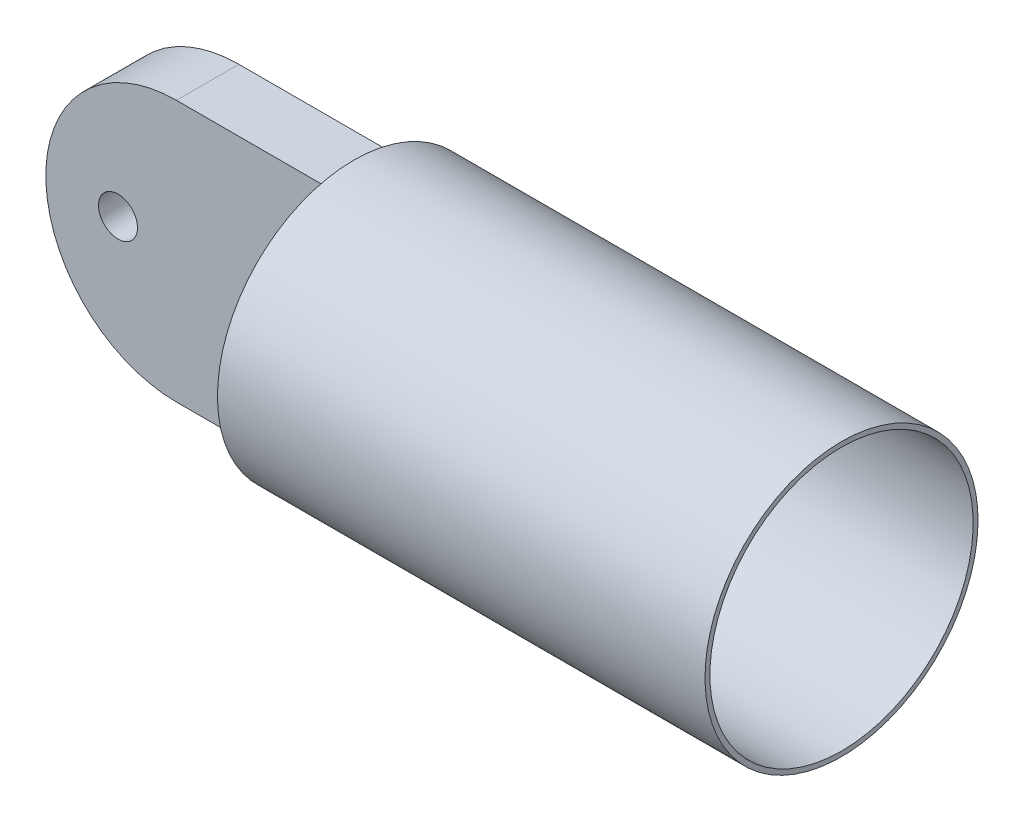
ISO-10303-21;
HEADER;
FILE_DESCRIPTION(('STEP AP214'),'2;1');
FILE_NAME('part.step','',(''),(''),'','','');
FILE_SCHEMA(('AUTOMOTIVE_DESIGN { 1 0 10303 214 1 1 1 1 }'));
ENDSEC;
DATA;
#1=APPLICATION_CONTEXT('core data for automotive mechanical design processes');
#2=APPLICATION_PROTOCOL_DEFINITION('international standard','automotive_design',2000,#1);
#3=PRODUCT_CONTEXT('',#1,'mechanical');
#4=PRODUCT('Part','Part','',(#3));
#5=PRODUCT_RELATED_PRODUCT_CATEGORY('part','',(#4));
#6=PRODUCT_DEFINITION_FORMATION('','',#4);
#7=PRODUCT_DEFINITION_CONTEXT('part definition',#1,'design');
#8=PRODUCT_DEFINITION('design','',#6,#7);
#9=PRODUCT_DEFINITION_SHAPE('','',#8);
#10=(LENGTH_UNIT() NAMED_UNIT(*) SI_UNIT(.MILLI.,.METRE.));
#11=(NAMED_UNIT(*) PLANE_ANGLE_UNIT() SI_UNIT($,.RADIAN.));
#12=(NAMED_UNIT(*) SI_UNIT($,.STERADIAN.) SOLID_ANGLE_UNIT());
#13=UNCERTAINTY_MEASURE_WITH_UNIT(LENGTH_MEASURE(1.E-05),#10,'distance_accuracy_value','');
#14=(GEOMETRIC_REPRESENTATION_CONTEXT(3) GLOBAL_UNCERTAINTY_ASSIGNED_CONTEXT((#13)) GLOBAL_UNIT_ASSIGNED_CONTEXT((#10,
#11,#12)) REPRESENTATION_CONTEXT('',''));
#15=CARTESIAN_POINT('',(0.,0.,0.));
#16=DIRECTION('',(0.,0.,1.));
#17=DIRECTION('',(1.,0.,0.));
#18=AXIS2_PLACEMENT_3D('',#15,#16,#17);
#19=CARTESIAN_POINT('',(-567.059552989297,341.601354358108,64.));
#20=DIRECTION('',(0.,0.,-1.));
#21=DIRECTION('',(-1.,0.,0.));
#22=AXIS2_PLACEMENT_3D('',#19,#20,#21);
#23=CYLINDRICAL_SURFACE('',#22,134.);
#24=CARTESIAN_POINT('',(-567.059552989297,341.601354358108,0.));
#25=DIRECTION('',(0.,0.,1.));
#26=DIRECTION('',(-1.,0.,0.));
#27=AXIS2_PLACEMENT_3D('',#24,#25,#26);
#28=CIRCLE('',#27,134.);
#29=CARTESIAN_POINT('',(-567.059552989297,475.601354358108,0.));
#30=VERTEX_POINT('',#29);
#31=CARTESIAN_POINT('',(-567.059552989297,207.601354358108,0.));
#32=VERTEX_POINT('',#31);
#33=EDGE_CURVE('E171',#30,#32,#28,.T.);
#34=ORIENTED_EDGE('',*,*,#33,.T.);
#35=DIRECTION('',(0.,0.,-1.));
#36=VECTOR('',#35,1.);
#37=CARTESIAN_POINT('',(-567.059552989297,207.601354358108,64.));
#38=LINE('',#37,#36);
#39=CARTESIAN_POINT('',(-567.059552989297,207.601354358108,64.));
#40=VERTEX_POINT('',#39);
#41=EDGE_CURVE('E11',#40,#32,#38,.T.);
#42=ORIENTED_EDGE('',*,*,#41,.F.);
#43=CARTESIAN_POINT('',(-567.059552989297,341.601354358108,64.));
#44=DIRECTION('',(0.,0.,1.));
#45=DIRECTION('',(-1.,0.,0.));
#46=AXIS2_PLACEMENT_3D('',#43,#44,#45);
#47=CIRCLE('',#46,134.);
#48=CARTESIAN_POINT('',(-567.059552989297,475.601354358108,64.));
#49=VERTEX_POINT('',#48);
#50=EDGE_CURVE('E172',#49,#40,#47,.T.);
#51=ORIENTED_EDGE('',*,*,#50,.F.);
#52=DIRECTION('',(0.,0.,-1.));
#53=VECTOR('',#52,1.);
#54=CARTESIAN_POINT('',(-567.059552989297,475.601354358108,64.));
#55=LINE('',#54,#53);
#56=EDGE_CURVE('E178',#49,#30,#55,.T.);
#57=ORIENTED_EDGE('',*,*,#56,.T.);
#58=EDGE_LOOP('',(#34,#42,#51,#57));
#59=FACE_BOUND('',#58,.T.);
#60=ADVANCED_FACE('F36',(#59),#23,.T.);
#61=CARTESIAN_POINT('',(-567.059552989297,207.601354358108,64.));
#62=DIRECTION('',(0.,1.,0.));
#63=DIRECTION('',(0.,0.,1.));
#64=AXIS2_PLACEMENT_3D('',#61,#62,#63);
#65=PLANE('',#64);
#66=DIRECTION('',(1.,0.,0.));
#67=VECTOR('',#66,1.);
#68=CARTESIAN_POINT('',(-567.059552989297,207.601354358108,0.));
#69=LINE('',#68,#67);
#70=CARTESIAN_POINT('',(-417.059552989296,207.601354358108,0.));
#71=VERTEX_POINT('',#70);
#72=EDGE_CURVE('E181',#32,#71,#69,.T.);
#73=ORIENTED_EDGE('',*,*,#72,.T.);
#74=DIRECTION('',(0.,0.,-1.));
#75=VECTOR('',#74,1.);
#76=CARTESIAN_POINT('',(-417.059552989296,207.601354358108,64.));
#77=LINE('',#76,#75);
#78=CARTESIAN_POINT('',(-417.059552989296,207.601354358108,64.));
#79=VERTEX_POINT('',#78);
#80=EDGE_CURVE('E44',#79,#71,#77,.T.);
#81=ORIENTED_EDGE('',*,*,#80,.F.);
#82=DIRECTION('',(1.,0.,0.));
#83=VECTOR('',#82,1.);
#84=CARTESIAN_POINT('',(-567.059552989297,207.601354358108,64.));
#85=LINE('',#84,#83);
#86=EDGE_CURVE('E76',#40,#79,#85,.T.);
#87=ORIENTED_EDGE('',*,*,#86,.F.);
#88=ORIENTED_EDGE('',*,*,#41,.T.);
#89=EDGE_LOOP('',(#73,#81,#87,#88));
#90=FACE_BOUND('',#89,.T.);
#91=ADVANCED_FACE('F193',(#90),#65,.F.);
#92=CARTESIAN_POINT('',(-567.059552989297,475.601354358108,64.));
#93=DIRECTION('',(0.,-1.,0.));
#94=DIRECTION('',(0.,0.,-1.));
#95=AXIS2_PLACEMENT_3D('',#92,#93,#94);
#96=PLANE('',#95);
#97=DIRECTION('',(-1.,0.,0.));
#98=VECTOR('',#97,1.);
#99=CARTESIAN_POINT('',(-567.059552989297,475.601354358108,0.));
#100=LINE('',#99,#98);
#101=CARTESIAN_POINT('',(-417.059552989297,475.601354358108,0.));
#102=VERTEX_POINT('',#101);
#103=EDGE_CURVE('E69',#102,#30,#100,.T.);
#104=ORIENTED_EDGE('',*,*,#103,.T.);
#105=ORIENTED_EDGE('',*,*,#56,.F.);
#106=DIRECTION('',(-1.,0.,0.));
#107=VECTOR('',#106,1.);
#108=CARTESIAN_POINT('',(-567.059552989297,475.601354358108,64.));
#109=LINE('',#108,#107);
#110=CARTESIAN_POINT('',(-417.059552989297,475.601354358108,64.));
#111=VERTEX_POINT('',#110);
#112=EDGE_CURVE('E52',#111,#49,#109,.T.);
#113=ORIENTED_EDGE('',*,*,#112,.F.);
#114=DIRECTION('',(0.,0.,-1.));
#115=VECTOR('',#114,1.);
#116=CARTESIAN_POINT('',(-417.059552989297,475.601354358108,64.));
#117=LINE('',#116,#115);
#118=EDGE_CURVE('E66',#111,#102,#117,.T.);
#119=ORIENTED_EDGE('',*,*,#118,.T.);
#120=EDGE_LOOP('',(#104,#105,#113,#119));
#121=FACE_BOUND('',#120,.T.);
#122=ADVANCED_FACE('F200',(#121),#96,.F.);
#123=CARTESIAN_POINT('',(-567.059552989297,341.601354358108,64.));
#124=DIRECTION('',(0.,0.,-1.));
#125=DIRECTION('',(-1.,0.,0.));
#126=AXIS2_PLACEMENT_3D('',#123,#124,#125);
#127=PLANE('',#126);
#128=CARTESIAN_POINT('',(-627.059552989297,342.387508152234,64.));
#129=DIRECTION('',(0.,0.,-1.));
#130=DIRECTION('',(-1.,0.,0.));
#131=AXIS2_PLACEMENT_3D('',#128,#129,#130);
#132=CIRCLE('',#131,20.);
#133=CARTESIAN_POINT('',(-647.059552989298,342.387508152234,64.));
#134=VERTEX_POINT('',#133);
#135=EDGE_CURVE('E168',#134,#134,#132,.T.);
#136=ORIENTED_EDGE('',*,*,#135,.T.);
#137=EDGE_LOOP('',(#136));
#138=FACE_BOUND('',#137,.T.);
#139=ORIENTED_EDGE('',*,*,#50,.T.);
#140=ORIENTED_EDGE('',*,*,#86,.T.);
#141=DIRECTION('',(0.,1.,0.));
#142=VECTOR('',#141,1.);
#143=CARTESIAN_POINT('',(-417.059552989297,475.601354358108,64.));
#144=LINE('',#143,#142);
#145=EDGE_CURVE('E175',#79,#111,#144,.T.);
#146=ORIENTED_EDGE('',*,*,#145,.T.);
#147=ORIENTED_EDGE('',*,*,#112,.T.);
#148=EDGE_LOOP('',(#139,#140,#146,#147));
#149=FACE_BOUND('',#148,.T.);
#150=ADVANCED_FACE('F202',(#138,#149),#127,.F.);
#151=CARTESIAN_POINT('',(-567.059552989297,341.601354358108,0.));
#152=DIRECTION('',(0.,0.,-1.));
#153=DIRECTION('',(-1.,0.,0.));
#154=AXIS2_PLACEMENT_3D('',#151,#152,#153);
#155=PLANE('',#154);
#156=CARTESIAN_POINT('',(-627.059552989297,342.387508152234,0.));
#157=DIRECTION('',(0.,0.,1.));
#158=DIRECTION('',(1.,0.,0.));
#159=AXIS2_PLACEMENT_3D('',#156,#157,#158);
#160=CIRCLE('',#159,20.);
#161=CARTESIAN_POINT('',(-607.059552989297,342.387508152234,0.));
#162=VERTEX_POINT('',#161);
#163=EDGE_CURVE('E163',#162,#162,#160,.T.);
#164=ORIENTED_EDGE('',*,*,#163,.T.);
#165=EDGE_LOOP('',(#164));
#166=FACE_BOUND('',#165,.T.);
#167=ORIENTED_EDGE('',*,*,#33,.F.);
#168=ORIENTED_EDGE('',*,*,#103,.F.);
#169=DIRECTION('',(0.,1.,0.));
#170=VECTOR('',#169,1.);
#171=CARTESIAN_POINT('',(-417.059552989297,475.601354358108,0.));
#172=LINE('',#171,#170);
#173=EDGE_CURVE('E184',#71,#102,#172,.T.);
#174=ORIENTED_EDGE('',*,*,#173,.F.);
#175=ORIENTED_EDGE('',*,*,#72,.F.);
#176=EDGE_LOOP('',(#167,#168,#174,#175));
#177=FACE_BOUND('',#176,.T.);
#178=ADVANCED_FACE('F197',(#166,#177),#155,.T.);
#179=CARTESIAN_POINT('',(-627.059552989297,342.387508152234,0.));
#180=DIRECTION('',(0.,0.,1.));
#181=DIRECTION('',(1.,0.,0.));
#182=AXIS2_PLACEMENT_3D('',#179,#180,#181);
#183=CYLINDRICAL_SURFACE('',#182,20.);
#184=ORIENTED_EDGE('',*,*,#163,.F.);
#185=EDGE_LOOP('',(#184));
#186=FACE_BOUND('',#185,.T.);
#187=ORIENTED_EDGE('',*,*,#135,.F.);
#188=EDGE_LOOP('',(#187));
#189=FACE_BOUND('',#188,.T.);
#190=ADVANCED_FACE('F225',(#186,#189),#183,.F.);
#191=CARTESIAN_POINT('',(-417.059552989297,341.601354358108,32.));
#192=DIRECTION('',(1.,0.,0.));
#193=DIRECTION('',(0.,1.,0.));
#194=AXIS2_PLACEMENT_3D('',#191,#192,#193);
#195=PLANE('',#194);
#196=CARTESIAN_POINT('',(-417.059552989297,341.601354358108,32.));
#197=DIRECTION('',(1.,0.,0.));
#198=DIRECTION('',(0.,1.,0.));
#199=AXIS2_PLACEMENT_3D('',#196,#197,#198);
#200=CIRCLE('',#199,140.);
#201=CARTESIAN_POINT('',(-417.059552989297,481.601354358108,32.));
#202=VERTEX_POINT('',#201);
#203=EDGE_CURVE('E126',#202,#202,#200,.T.);
#204=ORIENTED_EDGE('',*,*,#203,.F.);
#205=EDGE_LOOP('',(#204));
#206=FACE_BOUND('',#205,.T.);
#207=ORIENTED_EDGE('',*,*,#80,.T.);
#208=ORIENTED_EDGE('',*,*,#173,.T.);
#209=ORIENTED_EDGE('',*,*,#118,.F.);
#210=ORIENTED_EDGE('',*,*,#145,.F.);
#211=EDGE_LOOP('',(#207,#208,#209,#210));
#212=FACE_BOUND('',#211,.T.);
#213=ADVANCED_FACE('F192',(#206,#212),#195,.F.);
#214=CARTESIAN_POINT('',(82.9404470107033,341.601354358111,32.));
#215=DIRECTION('',(-1.,0.,0.));
#216=DIRECTION('',(0.,-1.,0.));
#217=AXIS2_PLACEMENT_3D('',#214,#215,#216);
#218=CYLINDRICAL_SURFACE('',#217,140.);
#219=CARTESIAN_POINT('',(82.9404470107033,341.601354358111,32.));
#220=DIRECTION('',(1.,0.,0.));
#221=DIRECTION('',(0.,1.,0.));
#222=AXIS2_PLACEMENT_3D('',#219,#220,#221);
#223=CIRCLE('',#222,140.);
#224=CARTESIAN_POINT('',(82.9404470107026,481.601354358111,32.));
#225=VERTEX_POINT('',#224);
#226=EDGE_CURVE('E160',#225,#225,#223,.T.);
#227=ORIENTED_EDGE('',*,*,#226,.F.);
#228=EDGE_LOOP('',(#227));
#229=FACE_BOUND('',#228,.T.);
#230=ORIENTED_EDGE('',*,*,#203,.T.);
#231=EDGE_LOOP('',(#230));
#232=FACE_BOUND('',#231,.T.);
#233=ADVANCED_FACE('F254',(#229,#232),#218,.T.);
#234=CARTESIAN_POINT('',(82.9404470107033,341.601354358111,32.));
#235=DIRECTION('',(1.,0.,0.));
#236=DIRECTION('',(0.,1.,0.));
#237=AXIS2_PLACEMENT_3D('',#234,#235,#236);
#238=PLANE('',#237);
#239=CARTESIAN_POINT('',(82.9404470107033,341.601354358111,32.));
#240=DIRECTION('',(1.,0.,0.));
#241=DIRECTION('',(0.,1.,0.));
#242=AXIS2_PLACEMENT_3D('',#239,#240,#241);
#243=CIRCLE('',#242,135.);
#244=CARTESIAN_POINT('',(82.9404470107026,476.601354358111,32.));
#245=VERTEX_POINT('',#244);
#246=EDGE_CURVE('E153',#245,#245,#243,.T.);
#247=ORIENTED_EDGE('',*,*,#246,.F.);
#248=EDGE_LOOP('',(#247));
#249=FACE_BOUND('',#248,.T.);
#250=ORIENTED_EDGE('',*,*,#226,.T.);
#251=EDGE_LOOP('',(#250));
#252=FACE_BOUND('',#251,.T.);
#253=ADVANCED_FACE('F265',(#249,#252),#238,.T.);
#254=CARTESIAN_POINT('',(-567.059552989297,341.601354358108,64.));
#255=DIRECTION('',(0.,0.,-1.));
#256=DIRECTION('',(-1.,0.,0.));
#257=AXIS2_PLACEMENT_3D('',#254,#255,#256);
#258=CYLINDRICAL_SURFACE('',#257,129.);
#259=CARTESIAN_POINT('',(-567.059552989297,341.601354358108,5.));
#260=DIRECTION('',(0.,0.,-1.));
#261=DIRECTION('',(-1.,0.,0.));
#262=AXIS2_PLACEMENT_3D('',#259,#260,#261);
#263=CIRCLE('',#262,129.);
#264=CARTESIAN_POINT('',(-567.059552989297,470.601354358108,5.));
#265=VERTEX_POINT('',#264);
#266=CARTESIAN_POINT('',(-567.059552989297,212.601354358108,5.));
#267=VERTEX_POINT('',#266);
#268=EDGE_CURVE('E117',#265,#267,#263,.F.);
#269=ORIENTED_EDGE('',*,*,#268,.F.);
#270=DIRECTION('',(0.,0.,-1.));
#271=VECTOR('',#270,1.);
#272=CARTESIAN_POINT('',(-567.059552989297,470.601354358108,64.));
#273=LINE('',#272,#271);
#274=CARTESIAN_POINT('',(-567.059552989297,470.601354358108,59.));
#275=VERTEX_POINT('',#274);
#276=EDGE_CURVE('E140',#275,#265,#273,.T.);
#277=ORIENTED_EDGE('',*,*,#276,.F.);
#278=CARTESIAN_POINT('',(-567.059552989297,341.601354358108,59.));
#279=DIRECTION('',(0.,0.,-1.));
#280=DIRECTION('',(-1.,0.,0.));
#281=AXIS2_PLACEMENT_3D('',#278,#279,#280);
#282=CIRCLE('',#281,129.);
#283=CARTESIAN_POINT('',(-567.059552989297,212.601354358108,59.));
#284=VERTEX_POINT('',#283);
#285=EDGE_CURVE('E125',#275,#284,#282,.F.);
#286=ORIENTED_EDGE('',*,*,#285,.T.);
#287=DIRECTION('',(0.,0.,1.));
#288=VECTOR('',#287,1.);
#289=CARTESIAN_POINT('',(-567.059552989297,212.601354358108,64.));
#290=LINE('',#289,#288);
#291=EDGE_CURVE('E110',#284,#267,#290,.F.);
#292=ORIENTED_EDGE('',*,*,#291,.T.);
#293=EDGE_LOOP('',(#269,#277,#286,#292));
#294=FACE_BOUND('',#293,.T.);
#295=ADVANCED_FACE('F122',(#294),#258,.F.);
#296=CARTESIAN_POINT('',(-567.059552989297,212.601354358108,64.));
#297=DIRECTION('',(0.,1.,0.));
#298=DIRECTION('',(0.,0.,1.));
#299=AXIS2_PLACEMENT_3D('',#296,#297,#298);
#300=PLANE('',#299);
#301=DIRECTION('',(1.,0.,0.));
#302=VECTOR('',#301,1.);
#303=CARTESIAN_POINT('',(-567.059552989297,212.601354358108,5.));
#304=LINE('',#303,#302);
#305=CARTESIAN_POINT('',(-412.059552989296,212.601354358108,5.));
#306=VERTEX_POINT('',#305);
#307=EDGE_CURVE('E107',#267,#306,#304,.T.);
#308=ORIENTED_EDGE('',*,*,#307,.F.);
#309=ORIENTED_EDGE('',*,*,#291,.F.);
#310=DIRECTION('',(1.,0.,0.));
#311=VECTOR('',#310,1.);
#312=CARTESIAN_POINT('',(-567.059552989297,212.601354358108,59.));
#313=LINE('',#312,#311);
#314=CARTESIAN_POINT('',(-412.059552989296,212.601354358108,59.));
#315=VERTEX_POINT('',#314);
#316=EDGE_CURVE('E139',#284,#315,#313,.T.);
#317=ORIENTED_EDGE('',*,*,#316,.T.);
#318=DIRECTION('',(0.,0.,-1.));
#319=VECTOR('',#318,1.);
#320=CARTESIAN_POINT('',(-412.059552989296,212.601354358108,64.));
#321=LINE('',#320,#319);
#322=EDGE_CURVE('E112',#315,#306,#321,.T.);
#323=ORIENTED_EDGE('',*,*,#322,.T.);
#324=EDGE_LOOP('',(#308,#309,#317,#323));
#325=FACE_BOUND('',#324,.T.);
#326=ADVANCED_FACE('F109',(#325),#300,.T.);
#327=CARTESIAN_POINT('',(-567.059552989297,470.601354358108,64.));
#328=DIRECTION('',(0.,-1.,0.));
#329=DIRECTION('',(0.,0.,-1.));
#330=AXIS2_PLACEMENT_3D('',#327,#328,#329);
#331=PLANE('',#330);
#332=DIRECTION('',(-1.,0.,0.));
#333=VECTOR('',#332,1.);
#334=CARTESIAN_POINT('',(-567.059552989297,470.601354358108,5.));
#335=LINE('',#334,#333);
#336=CARTESIAN_POINT('',(-412.059552989297,470.601354358108,5.));
#337=VERTEX_POINT('',#336);
#338=EDGE_CURVE('E130',#337,#265,#335,.T.);
#339=ORIENTED_EDGE('',*,*,#338,.F.);
#340=DIRECTION('',(0.,0.,-1.));
#341=VECTOR('',#340,1.);
#342=CARTESIAN_POINT('',(-412.059552989297,470.601354358108,32.));
#343=LINE('',#342,#341);
#344=CARTESIAN_POINT('',(-412.059552989297,470.601354358108,59.));
#345=VERTEX_POINT('',#344);
#346=EDGE_CURVE('E141',#345,#337,#343,.T.);
#347=ORIENTED_EDGE('',*,*,#346,.F.);
#348=DIRECTION('',(-1.,0.,0.));
#349=VECTOR('',#348,1.);
#350=CARTESIAN_POINT('',(-567.059552989297,470.601354358108,59.));
#351=LINE('',#350,#349);
#352=EDGE_CURVE('E142',#345,#275,#351,.T.);
#353=ORIENTED_EDGE('',*,*,#352,.T.);
#354=ORIENTED_EDGE('',*,*,#276,.T.);
#355=EDGE_LOOP('',(#339,#347,#353,#354));
#356=FACE_BOUND('',#355,.T.);
#357=ADVANCED_FACE('F295',(#356),#331,.T.);
#358=CARTESIAN_POINT('',(-567.059552989297,341.601354358108,59.));
#359=DIRECTION('',(0.,0.,-1.));
#360=DIRECTION('',(-1.,0.,0.));
#361=AXIS2_PLACEMENT_3D('',#358,#359,#360);
#362=PLANE('',#361);
#363=CARTESIAN_POINT('',(-627.059552989297,342.387508152234,59.));
#364=DIRECTION('',(0.,0.,-1.));
#365=DIRECTION('',(-1.,0.,0.));
#366=AXIS2_PLACEMENT_3D('',#363,#364,#365);
#367=CIRCLE('',#366,25.);
#368=CARTESIAN_POINT('',(-652.059552989297,342.387508152234,59.));
#369=VERTEX_POINT('',#368);
#370=EDGE_CURVE('E132',#369,#369,#367,.T.);
#371=ORIENTED_EDGE('',*,*,#370,.F.);
#372=EDGE_LOOP('',(#371));
#373=FACE_BOUND('',#372,.T.);
#374=ORIENTED_EDGE('',*,*,#285,.F.);
#375=ORIENTED_EDGE('',*,*,#352,.F.);
#376=DIRECTION('',(0.,1.,0.));
#377=VECTOR('',#376,1.);
#378=CARTESIAN_POINT('',(-412.059552989297,341.601354358108,59.));
#379=LINE('',#378,#377);
#380=EDGE_CURVE('E145',#315,#345,#379,.T.);
#381=ORIENTED_EDGE('',*,*,#380,.F.);
#382=ORIENTED_EDGE('',*,*,#316,.F.);
#383=EDGE_LOOP('',(#374,#375,#381,#382));
#384=FACE_BOUND('',#383,.T.);
#385=ADVANCED_FACE('F305',(#373,#384),#362,.T.);
#386=CARTESIAN_POINT('',(-567.059552989297,341.601354358108,5.));
#387=DIRECTION('',(0.,0.,-1.));
#388=DIRECTION('',(-1.,0.,0.));
#389=AXIS2_PLACEMENT_3D('',#386,#387,#388);
#390=PLANE('',#389);
#391=CARTESIAN_POINT('',(-627.059552989297,342.387508152234,5.));
#392=DIRECTION('',(0.,0.,-1.));
#393=DIRECTION('',(-1.,0.,0.));
#394=AXIS2_PLACEMENT_3D('',#391,#392,#393);
#395=CIRCLE('',#394,25.);
#396=CARTESIAN_POINT('',(-652.059552989297,342.387508152234,5.));
#397=VERTEX_POINT('',#396);
#398=EDGE_CURVE('E135',#397,#397,#395,.F.);
#399=ORIENTED_EDGE('',*,*,#398,.F.);
#400=EDGE_LOOP('',(#399));
#401=FACE_BOUND('',#400,.T.);
#402=ORIENTED_EDGE('',*,*,#268,.T.);
#403=ORIENTED_EDGE('',*,*,#307,.T.);
#404=DIRECTION('',(0.,1.,0.));
#405=VECTOR('',#404,1.);
#406=CARTESIAN_POINT('',(-412.059552989297,341.601354358108,5.));
#407=LINE('',#406,#405);
#408=EDGE_CURVE('E116',#306,#337,#407,.T.);
#409=ORIENTED_EDGE('',*,*,#408,.T.);
#410=ORIENTED_EDGE('',*,*,#338,.T.);
#411=EDGE_LOOP('',(#402,#403,#409,#410));
#412=FACE_BOUND('',#411,.T.);
#413=ADVANCED_FACE('F128',(#401,#412),#390,.F.);
#414=CARTESIAN_POINT('',(-627.059552989297,342.387508152234,0.));
#415=DIRECTION('',(0.,0.,1.));
#416=DIRECTION('',(1.,0.,0.));
#417=AXIS2_PLACEMENT_3D('',#414,#415,#416);
#418=CYLINDRICAL_SURFACE('',#417,25.);
#419=ORIENTED_EDGE('',*,*,#398,.T.);
#420=EDGE_LOOP('',(#419));
#421=FACE_BOUND('',#420,.T.);
#422=ORIENTED_EDGE('',*,*,#370,.T.);
#423=EDGE_LOOP('',(#422));
#424=FACE_BOUND('',#423,.T.);
#425=ADVANCED_FACE('F326',(#421,#424),#418,.T.);
#426=CARTESIAN_POINT('',(-412.059552989297,341.601354358108,32.));
#427=DIRECTION('',(1.,0.,0.));
#428=DIRECTION('',(0.,1.,0.));
#429=AXIS2_PLACEMENT_3D('',#426,#427,#428);
#430=PLANE('',#429);
#431=CARTESIAN_POINT('',(-412.059552989297,341.601354358108,32.));
#432=DIRECTION('',(1.,0.,0.));
#433=DIRECTION('',(0.,1.,0.));
#434=AXIS2_PLACEMENT_3D('',#431,#432,#433);
#435=CIRCLE('',#434,135.);
#436=CARTESIAN_POINT('',(-412.059552989297,476.601354358108,32.));
#437=VERTEX_POINT('',#436);
#438=EDGE_CURVE('E155',#437,#437,#435,.T.);
#439=ORIENTED_EDGE('',*,*,#438,.T.);
#440=EDGE_LOOP('',(#439));
#441=FACE_BOUND('',#440,.T.);
#442=ORIENTED_EDGE('',*,*,#322,.F.);
#443=ORIENTED_EDGE('',*,*,#380,.T.);
#444=ORIENTED_EDGE('',*,*,#346,.T.);
#445=ORIENTED_EDGE('',*,*,#408,.F.);
#446=EDGE_LOOP('',(#442,#443,#444,#445));
#447=FACE_BOUND('',#446,.T.);
#448=ADVANCED_FACE('F337',(#441,#447),#430,.T.);
#449=CARTESIAN_POINT('',(82.9404470107033,341.601354358111,32.));
#450=DIRECTION('',(-1.,0.,0.));
#451=DIRECTION('',(0.,-1.,0.));
#452=AXIS2_PLACEMENT_3D('',#449,#450,#451);
#453=CYLINDRICAL_SURFACE('',#452,135.);
#454=ORIENTED_EDGE('',*,*,#246,.T.);
#455=EDGE_LOOP('',(#454));
#456=FACE_BOUND('',#455,.T.);
#457=ORIENTED_EDGE('',*,*,#438,.F.);
#458=EDGE_LOOP('',(#457));
#459=FACE_BOUND('',#458,.T.);
#460=ADVANCED_FACE('F348',(#456,#459),#453,.F.);
#461=CLOSED_SHELL('',(#60,#91,#122,#150,#178,#190,#213,#233,#253,#295,#326,#357,#385,#413,#425,
#448,#460));
#462=MANIFOLD_SOLID_BREP('B2',#461);
#463=ADVANCED_BREP_SHAPE_REPRESENTATION('',(#18,#462),#14);
#464=SHAPE_DEFINITION_REPRESENTATION(#9,#463);
ENDSEC;
END-ISO-10303-21;
